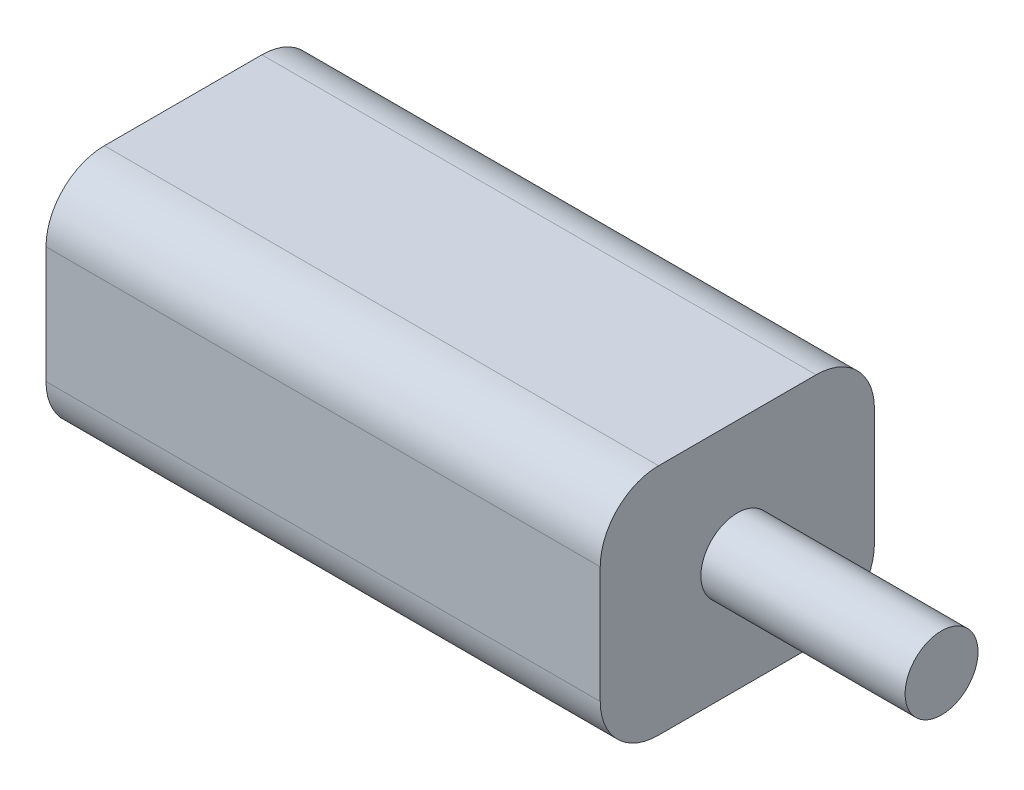
ISO-10303-21;
HEADER;
FILE_DESCRIPTION(('STEP AP214'),'2;1');
FILE_NAME('part.step','',(''),(''),'','','');
FILE_SCHEMA(('AUTOMOTIVE_DESIGN { 1 0 10303 214 1 1 1 1 }'));
ENDSEC;
DATA;
#1=APPLICATION_CONTEXT('core data for automotive mechanical design processes');
#2=APPLICATION_PROTOCOL_DEFINITION('international standard','automotive_design',2000,#1);
#3=PRODUCT_CONTEXT('',#1,'mechanical');
#4=PRODUCT('Part','Part','',(#3));
#5=PRODUCT_RELATED_PRODUCT_CATEGORY('part','',(#4));
#6=PRODUCT_DEFINITION_FORMATION('','',#4);
#7=PRODUCT_DEFINITION_CONTEXT('part definition',#1,'design');
#8=PRODUCT_DEFINITION('design','',#6,#7);
#9=PRODUCT_DEFINITION_SHAPE('','',#8);
#10=(LENGTH_UNIT() NAMED_UNIT(*) SI_UNIT(.MILLI.,.METRE.));
#11=(NAMED_UNIT(*) PLANE_ANGLE_UNIT() SI_UNIT($,.RADIAN.));
#12=(NAMED_UNIT(*) SI_UNIT($,.STERADIAN.) SOLID_ANGLE_UNIT());
#13=UNCERTAINTY_MEASURE_WITH_UNIT(LENGTH_MEASURE(1.E-05),#10,'distance_accuracy_value','');
#14=(GEOMETRIC_REPRESENTATION_CONTEXT(3) GLOBAL_UNCERTAINTY_ASSIGNED_CONTEXT((#13)) GLOBAL_UNIT_ASSIGNED_CONTEXT((#10,
#11,#12)) REPRESENTATION_CONTEXT('',''));
#15=CARTESIAN_POINT('',(0.,0.,0.));
#16=DIRECTION('',(0.,0.,1.));
#17=DIRECTION('',(1.,0.,0.));
#18=AXIS2_PLACEMENT_3D('',#15,#16,#17);
#19=CARTESIAN_POINT('',(24.13,0.,0.));
#20=DIRECTION('',(-1.,0.,0.));
#21=DIRECTION('',(0.,0.,1.));
#22=AXIS2_PLACEMENT_3D('',#19,#20,#21);
#23=PLANE('',#22);
#24=DIRECTION('',(0.,0.,-1.));
#25=VECTOR('',#24,1.);
#26=CARTESIAN_POINT('',(24.13,-5.08,5.969));
#27=LINE('',#26,#25);
#28=CARTESIAN_POINT('',(24.13,-5.08,3.429));
#29=VERTEX_POINT('',#28);
#30=CARTESIAN_POINT('',(24.13,-5.08,-3.429));
#31=VERTEX_POINT('',#30);
#32=EDGE_CURVE('E167',#29,#31,#27,.T.);
#33=ORIENTED_EDGE('',*,*,#32,.T.);
#34=CARTESIAN_POINT('',(24.13,-2.54,-3.429));
#35=DIRECTION('',(-1.,0.,0.));
#36=DIRECTION('',(0.,0.,1.));
#37=AXIS2_PLACEMENT_3D('',#34,#35,#36);
#38=CIRCLE('',#37,2.54);
#39=CARTESIAN_POINT('',(24.13,-2.54,-5.969));
#40=VERTEX_POINT('',#39);
#41=EDGE_CURVE('E145',#31,#40,#38,.F.);
#42=ORIENTED_EDGE('',*,*,#41,.T.);
#43=DIRECTION('',(0.,-1.,0.));
#44=VECTOR('',#43,1.);
#45=CARTESIAN_POINT('',(24.13,5.08,-5.969));
#46=LINE('',#45,#44);
#47=CARTESIAN_POINT('',(24.13,2.54,-5.969));
#48=VERTEX_POINT('',#47);
#49=EDGE_CURVE('E159',#48,#40,#46,.T.);
#50=ORIENTED_EDGE('',*,*,#49,.F.);
#51=CARTESIAN_POINT('',(24.13,2.54,-3.429));
#52=DIRECTION('',(-1.,0.,0.));
#53=DIRECTION('',(0.,0.,1.));
#54=AXIS2_PLACEMENT_3D('',#51,#52,#53);
#55=CIRCLE('',#54,2.54);
#56=CARTESIAN_POINT('',(24.13,5.08,-3.429));
#57=VERTEX_POINT('',#56);
#58=EDGE_CURVE('E123',#48,#57,#55,.F.);
#59=ORIENTED_EDGE('',*,*,#58,.T.);
#60=DIRECTION('',(0.,0.,-1.));
#61=VECTOR('',#60,1.);
#62=CARTESIAN_POINT('',(24.13,5.08,5.969));
#63=LINE('',#62,#61);
#64=CARTESIAN_POINT('',(24.13,5.08,3.429));
#65=VERTEX_POINT('',#64);
#66=EDGE_CURVE('E157',#65,#57,#63,.T.);
#67=ORIENTED_EDGE('',*,*,#66,.F.);
#68=CARTESIAN_POINT('',(24.13,2.54,3.429));
#69=DIRECTION('',(-1.,0.,0.));
#70=DIRECTION('',(0.,0.,1.));
#71=AXIS2_PLACEMENT_3D('',#68,#69,#70);
#72=CIRCLE('',#71,2.54);
#73=CARTESIAN_POINT('',(24.13,2.54,5.969));
#74=VERTEX_POINT('',#73);
#75=EDGE_CURVE('E53',#65,#74,#72,.F.);
#76=ORIENTED_EDGE('',*,*,#75,.T.);
#77=DIRECTION('',(0.,-1.,0.));
#78=VECTOR('',#77,1.);
#79=CARTESIAN_POINT('',(24.13,5.08,5.969));
#80=LINE('',#79,#78);
#81=CARTESIAN_POINT('',(24.13,-2.54,5.969));
#82=VERTEX_POINT('',#81);
#83=EDGE_CURVE('E129',#74,#82,#80,.T.);
#84=ORIENTED_EDGE('',*,*,#83,.T.);
#85=CARTESIAN_POINT('',(24.13,-2.54,3.429));
#86=DIRECTION('',(-1.,0.,0.));
#87=DIRECTION('',(0.,0.,1.));
#88=AXIS2_PLACEMENT_3D('',#85,#86,#87);
#89=CIRCLE('',#88,2.54);
#90=EDGE_CURVE('E142',#82,#29,#89,.F.);
#91=ORIENTED_EDGE('',*,*,#90,.T.);
#92=EDGE_LOOP('',(#33,#42,#50,#59,#67,#76,#84,#91));
#93=FACE_BOUND('',#92,.T.);
#94=CARTESIAN_POINT('',(24.13,0.,0.));
#95=DIRECTION('',(-1.,0.,0.));
#96=DIRECTION('',(0.,0.,1.));
#97=AXIS2_PLACEMENT_3D('',#94,#95,#96);
#98=CIRCLE('',#97,1.5875);
#99=CARTESIAN_POINT('',(24.13,0.,1.5875));
#100=VERTEX_POINT('',#99);
#101=EDGE_CURVE('E124',#100,#100,#98,.F.);
#102=ORIENTED_EDGE('',*,*,#101,.F.);
#103=EDGE_LOOP('',(#102));
#104=FACE_BOUND('',#103,.T.);
#105=ADVANCED_FACE('F33',(#93,#104),#23,.F.);
#106=CARTESIAN_POINT('',(24.13,5.08,5.969));
#107=DIRECTION('',(0.,1.,0.));
#108=DIRECTION('',(0.,0.,1.));
#109=AXIS2_PLACEMENT_3D('',#106,#107,#108);
#110=PLANE('',#109);
#111=ORIENTED_EDGE('',*,*,#66,.T.);
#112=DIRECTION('',(-1.,0.,0.));
#113=VECTOR('',#112,1.);
#114=CARTESIAN_POINT('',(24.13,5.08,-3.429));
#115=LINE('',#114,#113);
#116=CARTESIAN_POINT('',(0.,5.08,-3.429));
#117=VERTEX_POINT('',#116);
#118=EDGE_CURVE('E149',#57,#117,#115,.T.);
#119=ORIENTED_EDGE('',*,*,#118,.T.);
#120=DIRECTION('',(0.,0.,-1.));
#121=VECTOR('',#120,1.);
#122=CARTESIAN_POINT('',(0.,5.08,5.969));
#123=LINE('',#122,#121);
#124=CARTESIAN_POINT('',(0.,5.08,3.429));
#125=VERTEX_POINT('',#124);
#126=EDGE_CURVE('E103',#125,#117,#123,.T.);
#127=ORIENTED_EDGE('',*,*,#126,.F.);
#128=DIRECTION('',(-1.,0.,0.));
#129=VECTOR('',#128,1.);
#130=CARTESIAN_POINT('',(24.13,5.08,3.429));
#131=LINE('',#130,#129);
#132=EDGE_CURVE('E147',#125,#65,#131,.F.);
#133=ORIENTED_EDGE('',*,*,#132,.T.);
#134=EDGE_LOOP('',(#111,#119,#127,#133));
#135=FACE_BOUND('',#134,.T.);
#136=ADVANCED_FACE('F183',(#135),#110,.T.);
#137=CARTESIAN_POINT('',(24.13,5.08,5.969));
#138=DIRECTION('',(0.,0.,-1.));
#139=DIRECTION('',(0.,1.,0.));
#140=AXIS2_PLACEMENT_3D('',#137,#138,#139);
#141=PLANE('',#140);
#142=DIRECTION('',(0.,-1.,0.));
#143=VECTOR('',#142,1.);
#144=CARTESIAN_POINT('',(0.,5.08,5.969));
#145=LINE('',#144,#143);
#146=CARTESIAN_POINT('',(0.,2.54,5.969));
#147=VERTEX_POINT('',#146);
#148=CARTESIAN_POINT('',(0.,-2.54,5.969));
#149=VERTEX_POINT('',#148);
#150=EDGE_CURVE('E154',#147,#149,#145,.T.);
#151=ORIENTED_EDGE('',*,*,#150,.T.);
#152=DIRECTION('',(-1.,0.,0.));
#153=VECTOR('',#152,1.);
#154=CARTESIAN_POINT('',(24.13,-2.54,5.969));
#155=LINE('',#154,#153);
#156=EDGE_CURVE('E11',#149,#82,#155,.F.);
#157=ORIENTED_EDGE('',*,*,#156,.T.);
#158=ORIENTED_EDGE('',*,*,#83,.F.);
#159=DIRECTION('',(-1.,0.,0.));
#160=VECTOR('',#159,1.);
#161=CARTESIAN_POINT('',(0.,2.54,5.969));
#162=LINE('',#161,#160);
#163=EDGE_CURVE('E41',#74,#147,#162,.T.);
#164=ORIENTED_EDGE('',*,*,#163,.T.);
#165=EDGE_LOOP('',(#151,#157,#158,#164));
#166=FACE_BOUND('',#165,.T.);
#167=ADVANCED_FACE('F153',(#166),#141,.F.);
#168=CARTESIAN_POINT('',(24.13,-5.08,5.969));
#169=DIRECTION('',(0.,1.,0.));
#170=DIRECTION('',(0.,0.,1.));
#171=AXIS2_PLACEMENT_3D('',#168,#169,#170);
#172=PLANE('',#171);
#173=DIRECTION('',(0.,0.,-1.));
#174=VECTOR('',#173,1.);
#175=CARTESIAN_POINT('',(0.,-5.08,5.969));
#176=LINE('',#175,#174);
#177=CARTESIAN_POINT('',(0.,-5.08,3.429));
#178=VERTEX_POINT('',#177);
#179=CARTESIAN_POINT('',(0.,-5.08,-3.429));
#180=VERTEX_POINT('',#179);
#181=EDGE_CURVE('E119',#178,#180,#176,.T.);
#182=ORIENTED_EDGE('',*,*,#181,.T.);
#183=DIRECTION('',(-1.,0.,0.));
#184=VECTOR('',#183,1.);
#185=CARTESIAN_POINT('',(24.13,-5.08,-3.429));
#186=LINE('',#185,#184);
#187=EDGE_CURVE('E139',#180,#31,#186,.F.);
#188=ORIENTED_EDGE('',*,*,#187,.T.);
#189=ORIENTED_EDGE('',*,*,#32,.F.);
#190=DIRECTION('',(-1.,0.,0.));
#191=VECTOR('',#190,1.);
#192=CARTESIAN_POINT('',(24.13,-5.08,3.429));
#193=LINE('',#192,#191);
#194=EDGE_CURVE('E136',#29,#178,#193,.T.);
#195=ORIENTED_EDGE('',*,*,#194,.T.);
#196=EDGE_LOOP('',(#182,#188,#189,#195));
#197=FACE_BOUND('',#196,.T.);
#198=ADVANCED_FACE('F196',(#197),#172,.F.);
#199=CARTESIAN_POINT('',(24.13,5.08,-5.969));
#200=DIRECTION('',(0.,0.,-1.));
#201=DIRECTION('',(0.,1.,0.));
#202=AXIS2_PLACEMENT_3D('',#199,#200,#201);
#203=PLANE('',#202);
#204=ORIENTED_EDGE('',*,*,#49,.T.);
#205=DIRECTION('',(-1.,0.,0.));
#206=VECTOR('',#205,1.);
#207=CARTESIAN_POINT('',(0.,-2.54,-5.969));
#208=LINE('',#207,#206);
#209=CARTESIAN_POINT('',(0.,-2.54,-5.969));
#210=VERTEX_POINT('',#209);
#211=EDGE_CURVE('E118',#40,#210,#208,.T.);
#212=ORIENTED_EDGE('',*,*,#211,.T.);
#213=DIRECTION('',(0.,-1.,0.));
#214=VECTOR('',#213,1.);
#215=CARTESIAN_POINT('',(0.,5.08,-5.969));
#216=LINE('',#215,#214);
#217=CARTESIAN_POINT('',(0.,2.54,-5.969));
#218=VERTEX_POINT('',#217);
#219=EDGE_CURVE('E101',#218,#210,#216,.T.);
#220=ORIENTED_EDGE('',*,*,#219,.F.);
#221=DIRECTION('',(-1.,0.,0.));
#222=VECTOR('',#221,1.);
#223=CARTESIAN_POINT('',(24.13,2.54,-5.969));
#224=LINE('',#223,#222);
#225=EDGE_CURVE('E115',#218,#48,#224,.F.);
#226=ORIENTED_EDGE('',*,*,#225,.T.);
#227=EDGE_LOOP('',(#204,#212,#220,#226));
#228=FACE_BOUND('',#227,.T.);
#229=ADVANCED_FACE('F114',(#228),#203,.T.);
#230=CARTESIAN_POINT('',(0.,0.,0.));
#231=DIRECTION('',(-1.,0.,0.));
#232=DIRECTION('',(0.,0.,1.));
#233=AXIS2_PLACEMENT_3D('',#230,#231,#232);
#234=PLANE('',#233);
#235=ORIENTED_EDGE('',*,*,#219,.T.);
#236=CARTESIAN_POINT('',(0.,-2.54,-3.429));
#237=DIRECTION('',(-1.,0.,0.));
#238=DIRECTION('',(0.,0.,1.));
#239=AXIS2_PLACEMENT_3D('',#236,#237,#238);
#240=CIRCLE('',#239,2.54);
#241=EDGE_CURVE('E108',#210,#180,#240,.T.);
#242=ORIENTED_EDGE('',*,*,#241,.T.);
#243=ORIENTED_EDGE('',*,*,#181,.F.);
#244=CARTESIAN_POINT('',(0.,-2.54,3.429));
#245=DIRECTION('',(-1.,0.,0.));
#246=DIRECTION('',(0.,0.,1.));
#247=AXIS2_PLACEMENT_3D('',#244,#245,#246);
#248=CIRCLE('',#247,2.54);
#249=EDGE_CURVE('E109',#178,#149,#248,.T.);
#250=ORIENTED_EDGE('',*,*,#249,.T.);
#251=ORIENTED_EDGE('',*,*,#150,.F.);
#252=CARTESIAN_POINT('',(0.,2.54,3.429));
#253=DIRECTION('',(-1.,0.,0.));
#254=DIRECTION('',(0.,0.,1.));
#255=AXIS2_PLACEMENT_3D('',#252,#253,#254);
#256=CIRCLE('',#255,2.54);
#257=EDGE_CURVE('E126',#147,#125,#256,.T.);
#258=ORIENTED_EDGE('',*,*,#257,.T.);
#259=ORIENTED_EDGE('',*,*,#126,.T.);
#260=CARTESIAN_POINT('',(0.,2.54,-3.429));
#261=DIRECTION('',(-1.,0.,0.));
#262=DIRECTION('',(0.,0.,1.));
#263=AXIS2_PLACEMENT_3D('',#260,#261,#262);
#264=CIRCLE('',#263,2.54);
#265=EDGE_CURVE('E98',#117,#218,#264,.T.);
#266=ORIENTED_EDGE('',*,*,#265,.T.);
#267=EDGE_LOOP('',(#235,#242,#243,#250,#251,#258,#259,#266));
#268=FACE_BOUND('',#267,.T.);
#269=ADVANCED_FACE('F100',(#268),#234,.T.);
#270=CARTESIAN_POINT('',(33.02,0.,0.));
#271=DIRECTION('',(-1.,0.,0.));
#272=DIRECTION('',(0.,0.,1.));
#273=AXIS2_PLACEMENT_3D('',#270,#271,#272);
#274=CYLINDRICAL_SURFACE('',#273,1.5875);
#275=CARTESIAN_POINT('',(33.02,0.,0.));
#276=DIRECTION('',(1.,0.,0.));
#277=DIRECTION('',(0.,0.,-1.));
#278=AXIS2_PLACEMENT_3D('',#275,#276,#277);
#279=CIRCLE('',#278,1.5875);
#280=CARTESIAN_POINT('',(33.02,0.,-1.5875));
#281=VERTEX_POINT('',#280);
#282=EDGE_CURVE('E165',#281,#281,#279,.T.);
#283=ORIENTED_EDGE('',*,*,#282,.F.);
#284=EDGE_LOOP('',(#283));
#285=FACE_BOUND('',#284,.T.);
#286=ORIENTED_EDGE('',*,*,#101,.T.);
#287=EDGE_LOOP('',(#286));
#288=FACE_BOUND('',#287,.T.);
#289=ADVANCED_FACE('F176',(#285,#288),#274,.T.);
#290=CARTESIAN_POINT('',(33.02,0.,0.));
#291=DIRECTION('',(1.,0.,0.));
#292=DIRECTION('',(0.,0.,-1.));
#293=AXIS2_PLACEMENT_3D('',#290,#291,#292);
#294=PLANE('',#293);
#295=ORIENTED_EDGE('',*,*,#282,.T.);
#296=EDGE_LOOP('',(#295));
#297=FACE_BOUND('',#296,.T.);
#298=ADVANCED_FACE('F174',(#297),#294,.T.);
#299=CARTESIAN_POINT('',(24.13,-2.54,-3.429));
#300=DIRECTION('',(1.,0.,0.));
#301=DIRECTION('',(0.,0.,-1.));
#302=AXIS2_PLACEMENT_3D('',#299,#300,#301);
#303=CYLINDRICAL_SURFACE('',#302,2.54);
#304=ORIENTED_EDGE('',*,*,#41,.F.);
#305=ORIENTED_EDGE('',*,*,#187,.F.);
#306=ORIENTED_EDGE('',*,*,#241,.F.);
#307=ORIENTED_EDGE('',*,*,#211,.F.);
#308=EDGE_LOOP('',(#304,#305,#306,#307));
#309=FACE_BOUND('',#308,.T.);
#310=ADVANCED_FACE('F202',(#309),#303,.T.);
#311=CARTESIAN_POINT('',(24.13,2.54,-3.429));
#312=DIRECTION('',(-1.,0.,0.));
#313=DIRECTION('',(0.,0.,1.));
#314=AXIS2_PLACEMENT_3D('',#311,#312,#313);
#315=CYLINDRICAL_SURFACE('',#314,2.54);
#316=ORIENTED_EDGE('',*,*,#58,.F.);
#317=ORIENTED_EDGE('',*,*,#225,.F.);
#318=ORIENTED_EDGE('',*,*,#265,.F.);
#319=ORIENTED_EDGE('',*,*,#118,.F.);
#320=EDGE_LOOP('',(#316,#317,#318,#319));
#321=FACE_BOUND('',#320,.T.);
#322=ADVANCED_FACE('F122',(#321),#315,.T.);
#323=CARTESIAN_POINT('',(24.13,-2.54,3.429));
#324=DIRECTION('',(-1.,0.,0.));
#325=DIRECTION('',(0.,0.,1.));
#326=AXIS2_PLACEMENT_3D('',#323,#324,#325);
#327=CYLINDRICAL_SURFACE('',#326,2.54);
#328=ORIENTED_EDGE('',*,*,#90,.F.);
#329=ORIENTED_EDGE('',*,*,#156,.F.);
#330=ORIENTED_EDGE('',*,*,#249,.F.);
#331=ORIENTED_EDGE('',*,*,#194,.F.);
#332=EDGE_LOOP('',(#328,#329,#330,#331));
#333=FACE_BOUND('',#332,.T.);
#334=ADVANCED_FACE('F207',(#333),#327,.T.);
#335=CARTESIAN_POINT('',(24.13,2.54,3.429));
#336=DIRECTION('',(1.,0.,0.));
#337=DIRECTION('',(0.,0.,-1.));
#338=AXIS2_PLACEMENT_3D('',#335,#336,#337);
#339=CYLINDRICAL_SURFACE('',#338,2.54);
#340=ORIENTED_EDGE('',*,*,#75,.F.);
#341=ORIENTED_EDGE('',*,*,#132,.F.);
#342=ORIENTED_EDGE('',*,*,#257,.F.);
#343=ORIENTED_EDGE('',*,*,#163,.F.);
#344=EDGE_LOOP('',(#340,#341,#342,#343));
#345=FACE_BOUND('',#344,.T.);
#346=ADVANCED_FACE('F35',(#345),#339,.T.);
#347=CLOSED_SHELL('',(#105,#136,#167,#198,#229,#269,#289,#298,#310,#322,#334,#346));
#348=MANIFOLD_SOLID_BREP('B2',#347);
#349=ADVANCED_BREP_SHAPE_REPRESENTATION('',(#18,#348),#14);
#350=SHAPE_DEFINITION_REPRESENTATION(#9,#349);
ENDSEC;
END-ISO-10303-21;
